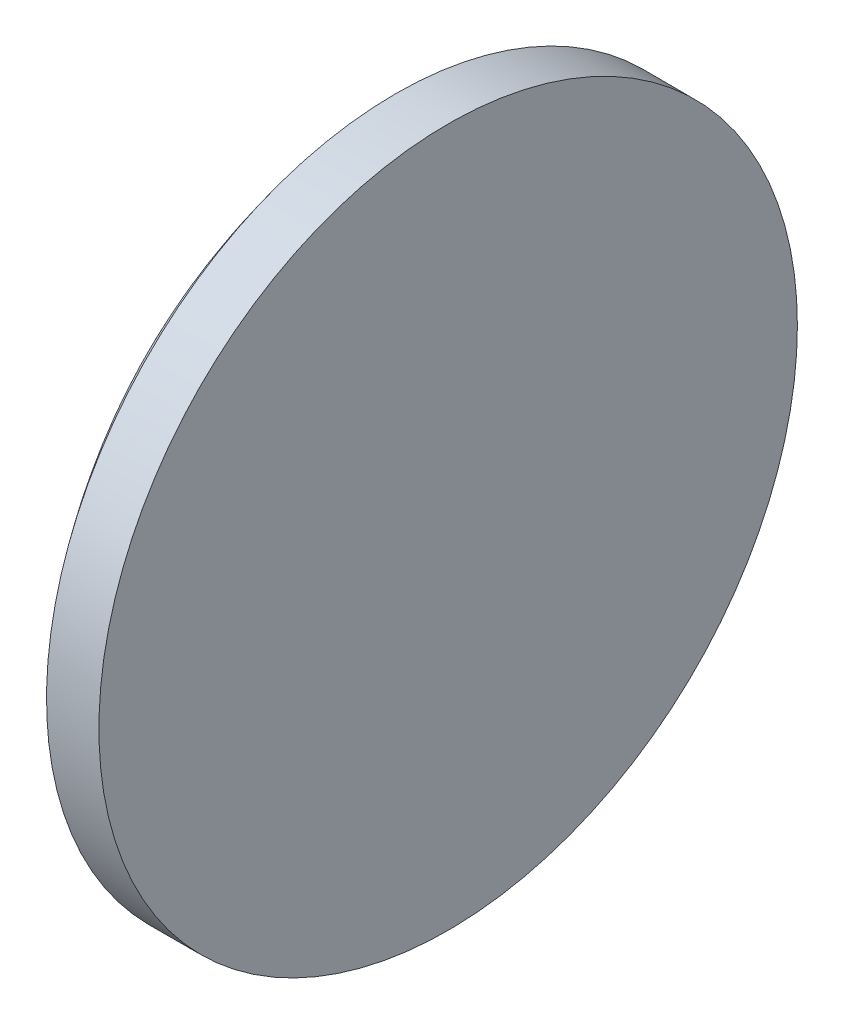
ISO-10303-21;
HEADER;
FILE_DESCRIPTION(('STEP AP214'),'2;1');
FILE_NAME('part.step','',(''),(''),'','','');
FILE_SCHEMA(('AUTOMOTIVE_DESIGN { 1 0 10303 214 1 1 1 1 }'));
ENDSEC;
DATA;
#1=APPLICATION_CONTEXT('core data for automotive mechanical design processes');
#2=APPLICATION_PROTOCOL_DEFINITION('international standard','automotive_design',2000,#1);
#3=PRODUCT_CONTEXT('',#1,'mechanical');
#4=PRODUCT('Part','Part','',(#3));
#5=PRODUCT_RELATED_PRODUCT_CATEGORY('part','',(#4));
#6=PRODUCT_DEFINITION_FORMATION('','',#4);
#7=PRODUCT_DEFINITION_CONTEXT('part definition',#1,'design');
#8=PRODUCT_DEFINITION('design','',#6,#7);
#9=PRODUCT_DEFINITION_SHAPE('','',#8);
#10=(LENGTH_UNIT() NAMED_UNIT(*) SI_UNIT(.MILLI.,.METRE.));
#11=(NAMED_UNIT(*) PLANE_ANGLE_UNIT() SI_UNIT($,.RADIAN.));
#12=(NAMED_UNIT(*) SI_UNIT($,.STERADIAN.) SOLID_ANGLE_UNIT());
#13=UNCERTAINTY_MEASURE_WITH_UNIT(LENGTH_MEASURE(1.E-05),#10,'distance_accuracy_value','');
#14=(GEOMETRIC_REPRESENTATION_CONTEXT(3) GLOBAL_UNCERTAINTY_ASSIGNED_CONTEXT((#13)) GLOBAL_UNIT_ASSIGNED_CONTEXT((#10,
#11,#12)) REPRESENTATION_CONTEXT('',''));
#15=CARTESIAN_POINT('',(0.,0.,0.));
#16=DIRECTION('',(0.,0.,1.));
#17=DIRECTION('',(1.,0.,0.));
#18=AXIS2_PLACEMENT_3D('',#15,#16,#17);
#19=CARTESIAN_POINT('',(0.,0.,0.));
#20=DIRECTION('',(1.,0.,0.));
#21=DIRECTION('',(0.,0.,-1.));
#22=AXIS2_PLACEMENT_3D('',#19,#20,#21);
#23=PLANE('',#22);
#24=CARTESIAN_POINT('',(0.,0.,0.));
#25=DIRECTION('',(1.,0.,0.));
#26=DIRECTION('',(0.,0.,-1.));
#27=AXIS2_PLACEMENT_3D('',#24,#25,#26);
#28=CIRCLE('',#27,2.);
#29=CARTESIAN_POINT('',(0.,0.,-2.));
#30=VERTEX_POINT('',#29);
#31=EDGE_CURVE('E40',#30,#30,#28,.T.);
#32=ORIENTED_EDGE('',*,*,#31,.T.);
#33=EDGE_LOOP('',(#32));
#34=FACE_BOUND('',#33,.T.);
#35=ADVANCED_FACE('F34',(#34),#23,.T.);
#36=CARTESIAN_POINT('',(-0.3,2.,0.));
#37=CARTESIAN_POINT('',(-0.762879564937962,1.40605702405268,0.));
#38=CARTESIAN_POINT('',(-1.,0.947696714103026,0.));
#39=CARTESIAN_POINT('',(-1.,0.,0.));
#40=B_SPLINE_CURVE_WITH_KNOTS('',3,(#36,#37,#38,#39),.UNSPECIFIED.,.F.,.F.,(4,4),(0.,1.),.UNSPECIFIED.);
#41=CARTESIAN_POINT('',(0.,0.,0.));
#42=DIRECTION('',(1.,0.,0.));
#43=AXIS1_PLACEMENT('',#41,#42);
#44=SURFACE_OF_REVOLUTION('',#40,#43);
#45=CARTESIAN_POINT('',(-1.,0.,0.));
#46=VERTEX_POINT('',#45);
#47=VERTEX_LOOP('',#46);
#48=FACE_BOUND('',#47,.T.);
#49=CARTESIAN_POINT('',(-0.3,0.,0.));
#50=DIRECTION('',(1.,0.,0.));
#51=DIRECTION('',(0.,0.,-1.));
#52=AXIS2_PLACEMENT_3D('',#49,#50,#51);
#53=CIRCLE('',#52,2.);
#54=CARTESIAN_POINT('',(-0.3,0.,-2.));
#55=VERTEX_POINT('',#54);
#56=EDGE_CURVE('E11',#55,#55,#53,.T.);
#57=ORIENTED_EDGE('',*,*,#56,.F.);
#58=EDGE_LOOP('',(#57));
#59=FACE_BOUND('',#58,.T.);
#60=ADVANCED_FACE('F43',(#48,#59),#44,.F.);
#61=CARTESIAN_POINT('',(0.,0.,0.));
#62=DIRECTION('',(1.,0.,0.));
#63=DIRECTION('',(0.,0.,-1.));
#64=AXIS2_PLACEMENT_3D('',#61,#62,#63);
#65=CYLINDRICAL_SURFACE('',#64,2.);
#66=ORIENTED_EDGE('',*,*,#56,.T.);
#67=EDGE_LOOP('',(#66));
#68=FACE_BOUND('',#67,.T.);
#69=ORIENTED_EDGE('',*,*,#31,.F.);
#70=EDGE_LOOP('',(#69));
#71=FACE_BOUND('',#70,.T.);
#72=ADVANCED_FACE('F46',(#68,#71),#65,.T.);
#73=CLOSED_SHELL('',(#35,#60,#72));
#74=MANIFOLD_SOLID_BREP('B2',#73);
#75=ADVANCED_BREP_SHAPE_REPRESENTATION('',(#18,#74),#14);
#76=SHAPE_DEFINITION_REPRESENTATION(#9,#75);
ENDSEC;
END-ISO-10303-21;
